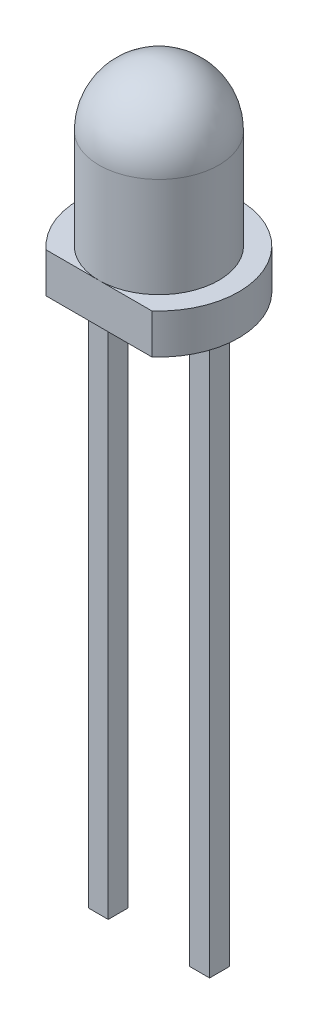
ISO-10303-21;
HEADER;
FILE_DESCRIPTION(('STEP AP214'),'2;1');
FILE_NAME('part.step','',(''),(''),'','','');
FILE_SCHEMA(('AUTOMOTIVE_DESIGN { 1 0 10303 214 1 1 1 1 }'));
ENDSEC;
DATA;
#1=APPLICATION_CONTEXT('core data for automotive mechanical design processes');
#2=APPLICATION_PROTOCOL_DEFINITION('international standard','automotive_design',2000,#1);
#3=PRODUCT_CONTEXT('',#1,'mechanical');
#4=PRODUCT('Part','Part','',(#3));
#5=PRODUCT_RELATED_PRODUCT_CATEGORY('part','',(#4));
#6=PRODUCT_DEFINITION_FORMATION('','',#4);
#7=PRODUCT_DEFINITION_CONTEXT('part definition',#1,'design');
#8=PRODUCT_DEFINITION('design','',#6,#7);
#9=PRODUCT_DEFINITION_SHAPE('','',#8);
#10=(LENGTH_UNIT() NAMED_UNIT(*) SI_UNIT(.MILLI.,.METRE.));
#11=(NAMED_UNIT(*) PLANE_ANGLE_UNIT() SI_UNIT($,.RADIAN.));
#12=(NAMED_UNIT(*) SI_UNIT($,.STERADIAN.) SOLID_ANGLE_UNIT());
#13=UNCERTAINTY_MEASURE_WITH_UNIT(LENGTH_MEASURE(1.E-05),#10,'distance_accuracy_value','');
#14=(GEOMETRIC_REPRESENTATION_CONTEXT(3) GLOBAL_UNCERTAINTY_ASSIGNED_CONTEXT((#13)) GLOBAL_UNIT_ASSIGNED_CONTEXT((#10,
#11,#12)) REPRESENTATION_CONTEXT('',''));
#15=CARTESIAN_POINT('',(0.,0.,0.));
#16=DIRECTION('',(0.,0.,1.));
#17=DIRECTION('',(1.,0.,0.));
#18=AXIS2_PLACEMENT_3D('',#15,#16,#17);
#19=CARTESIAN_POINT('',(1.02,-14.,0.25));
#20=DIRECTION('',(1.,0.,0.));
#21=DIRECTION('',(0.,0.,-1.));
#22=AXIS2_PLACEMENT_3D('',#19,#20,#21);
#23=PLANE('',#22);
#24=DIRECTION('',(0.,0.,-1.));
#25=VECTOR('',#24,1.);
#26=CARTESIAN_POINT('',(1.02,0.,0.25));
#27=LINE('',#26,#25);
#28=CARTESIAN_POINT('',(1.02,0.,0.25));
#29=VERTEX_POINT('',#28);
#30=CARTESIAN_POINT('',(1.02,0.,-0.25));
#31=VERTEX_POINT('',#30);
#32=EDGE_CURVE('E12',#29,#31,#27,.T.);
#33=ORIENTED_EDGE('',*,*,#32,.T.);
#34=DIRECTION('',(0.,1.,0.));
#35=VECTOR('',#34,1.);
#36=CARTESIAN_POINT('',(1.02,-14.,-0.25));
#37=LINE('',#36,#35);
#38=CARTESIAN_POINT('',(1.02,-14.,-0.25));
#39=VERTEX_POINT('',#38);
#40=EDGE_CURVE('E121',#39,#31,#37,.T.);
#41=ORIENTED_EDGE('',*,*,#40,.F.);
#42=DIRECTION('',(0.,0.,-1.));
#43=VECTOR('',#42,1.);
#44=CARTESIAN_POINT('',(1.02,-14.,0.25));
#45=LINE('',#44,#43);
#46=CARTESIAN_POINT('',(1.02,-14.,0.25));
#47=VERTEX_POINT('',#46);
#48=EDGE_CURVE('E54',#47,#39,#45,.T.);
#49=ORIENTED_EDGE('',*,*,#48,.F.);
#50=DIRECTION('',(0.,1.,0.));
#51=VECTOR('',#50,1.);
#52=CARTESIAN_POINT('',(1.02,-14.,0.25));
#53=LINE('',#52,#51);
#54=EDGE_CURVE('E109',#47,#29,#53,.T.);
#55=ORIENTED_EDGE('',*,*,#54,.T.);
#56=EDGE_LOOP('',(#33,#41,#49,#55));
#57=FACE_BOUND('',#56,.T.);
#58=ADVANCED_FACE('F50',(#57),#23,.F.);
#59=CARTESIAN_POINT('',(1.02,-14.,-0.25));
#60=DIRECTION('',(0.,0.,1.));
#61=DIRECTION('',(1.,0.,0.));
#62=AXIS2_PLACEMENT_3D('',#59,#60,#61);
#63=PLANE('',#62);
#64=DIRECTION('',(1.,0.,0.));
#65=VECTOR('',#64,1.);
#66=CARTESIAN_POINT('',(1.02,0.,-0.25));
#67=LINE('',#66,#65);
#68=CARTESIAN_POINT('',(1.52,0.,-0.25));
#69=VERTEX_POINT('',#68);
#70=EDGE_CURVE('E60',#31,#69,#67,.T.);
#71=ORIENTED_EDGE('',*,*,#70,.T.);
#72=DIRECTION('',(0.,1.,0.));
#73=VECTOR('',#72,1.);
#74=CARTESIAN_POINT('',(1.52,-14.,-0.25));
#75=LINE('',#74,#73);
#76=CARTESIAN_POINT('',(1.52,-14.,-0.25));
#77=VERTEX_POINT('',#76);
#78=EDGE_CURVE('E105',#77,#69,#75,.T.);
#79=ORIENTED_EDGE('',*,*,#78,.F.);
#80=DIRECTION('',(1.,0.,0.));
#81=VECTOR('',#80,1.);
#82=CARTESIAN_POINT('',(1.02,-14.,-0.25));
#83=LINE('',#82,#81);
#84=EDGE_CURVE('E84',#39,#77,#83,.T.);
#85=ORIENTED_EDGE('',*,*,#84,.F.);
#86=ORIENTED_EDGE('',*,*,#40,.T.);
#87=EDGE_LOOP('',(#71,#79,#85,#86));
#88=FACE_BOUND('',#87,.T.);
#89=ADVANCED_FACE('F124',(#88),#63,.F.);
#90=CARTESIAN_POINT('',(1.52,-14.,0.25));
#91=DIRECTION('',(-1.,0.,0.));
#92=DIRECTION('',(0.,0.,1.));
#93=AXIS2_PLACEMENT_3D('',#90,#91,#92);
#94=PLANE('',#93);
#95=DIRECTION('',(0.,0.,1.));
#96=VECTOR('',#95,1.);
#97=CARTESIAN_POINT('',(1.52,0.,0.25));
#98=LINE('',#97,#96);
#99=CARTESIAN_POINT('',(1.52,0.,0.25));
#100=VERTEX_POINT('',#99);
#101=EDGE_CURVE('E100',#69,#100,#98,.T.);
#102=ORIENTED_EDGE('',*,*,#101,.T.);
#103=DIRECTION('',(0.,1.,0.));
#104=VECTOR('',#103,1.);
#105=CARTESIAN_POINT('',(1.52,-14.,0.25));
#106=LINE('',#105,#104);
#107=CARTESIAN_POINT('',(1.52,-14.,0.25));
#108=VERTEX_POINT('',#107);
#109=EDGE_CURVE('E103',#108,#100,#106,.T.);
#110=ORIENTED_EDGE('',*,*,#109,.F.);
#111=DIRECTION('',(0.,0.,1.));
#112=VECTOR('',#111,1.);
#113=CARTESIAN_POINT('',(1.52,-14.,0.25));
#114=LINE('',#113,#112);
#115=EDGE_CURVE('E117',#77,#108,#114,.T.);
#116=ORIENTED_EDGE('',*,*,#115,.F.);
#117=ORIENTED_EDGE('',*,*,#78,.T.);
#118=EDGE_LOOP('',(#102,#110,#116,#117));
#119=FACE_BOUND('',#118,.T.);
#120=ADVANCED_FACE('F101',(#119),#94,.F.);
#121=CARTESIAN_POINT('',(1.02,-14.,0.25));
#122=DIRECTION('',(0.,0.,-1.));
#123=DIRECTION('',(-1.,0.,0.));
#124=AXIS2_PLACEMENT_3D('',#121,#122,#123);
#125=PLANE('',#124);
#126=DIRECTION('',(-1.,0.,0.));
#127=VECTOR('',#126,1.);
#128=CARTESIAN_POINT('',(1.02,0.,0.25));
#129=LINE('',#128,#127);
#130=EDGE_CURVE('E94',#100,#29,#129,.T.);
#131=ORIENTED_EDGE('',*,*,#130,.T.);
#132=ORIENTED_EDGE('',*,*,#54,.F.);
#133=DIRECTION('',(-1.,0.,0.));
#134=VECTOR('',#133,1.);
#135=CARTESIAN_POINT('',(1.02,-14.,0.25));
#136=LINE('',#135,#134);
#137=EDGE_CURVE('E108',#108,#47,#136,.T.);
#138=ORIENTED_EDGE('',*,*,#137,.F.);
#139=ORIENTED_EDGE('',*,*,#109,.T.);
#140=EDGE_LOOP('',(#131,#132,#138,#139));
#141=FACE_BOUND('',#140,.T.);
#142=ADVANCED_FACE('F107',(#141),#125,.F.);
#143=CARTESIAN_POINT('',(0.,-14.,0.));
#144=DIRECTION('',(0.,-1.,0.));
#145=DIRECTION('',(0.,0.,-1.));
#146=AXIS2_PLACEMENT_3D('',#143,#144,#145);
#147=PLANE('',#146);
#148=ORIENTED_EDGE('',*,*,#48,.T.);
#149=ORIENTED_EDGE('',*,*,#84,.T.);
#150=ORIENTED_EDGE('',*,*,#115,.T.);
#151=ORIENTED_EDGE('',*,*,#137,.T.);
#152=EDGE_LOOP('',(#148,#149,#150,#151));
#153=FACE_BOUND('',#152,.T.);
#154=ADVANCED_FACE('F52',(#153),#147,.T.);
#155=CARTESIAN_POINT('',(0.,0.,0.));
#156=DIRECTION('',(0.,-1.,0.));
#157=DIRECTION('',(0.,0.,-1.));
#158=AXIS2_PLACEMENT_3D('',#155,#156,#157);
#159=PLANE('',#158);
#160=ORIENTED_EDGE('',*,*,#32,.F.);
#161=ORIENTED_EDGE('',*,*,#130,.F.);
#162=ORIENTED_EDGE('',*,*,#101,.F.);
#163=ORIENTED_EDGE('',*,*,#70,.F.);
#164=EDGE_LOOP('',(#160,#161,#162,#163));
#165=FACE_BOUND('',#164,.T.);
#166=ADVANCED_FACE('F111',(#165),#159,.F.);
#167=CLOSED_SHELL('',(#58,#89,#120,#142,#154,#166));
#168=MANIFOLD_SOLID_BREP('B2',#167);
#169=CARTESIAN_POINT('',(-1.52,-14.,0.25));
#170=DIRECTION('',(1.,0.,0.));
#171=DIRECTION('',(0.,0.,-1.));
#172=AXIS2_PLACEMENT_3D('',#169,#170,#171);
#173=PLANE('',#172);
#174=DIRECTION('',(0.,0.,-1.));
#175=VECTOR('',#174,1.);
#176=CARTESIAN_POINT('',(-1.52,0.,0.25));
#177=LINE('',#176,#175);
#178=CARTESIAN_POINT('',(-1.52,0.,0.25));
#179=VERTEX_POINT('',#178);
#180=CARTESIAN_POINT('',(-1.52,0.,-0.25));
#181=VERTEX_POINT('',#180);
#182=EDGE_CURVE('E258',#179,#181,#177,.T.);
#183=ORIENTED_EDGE('',*,*,#182,.T.);
#184=DIRECTION('',(0.,1.,0.));
#185=VECTOR('',#184,1.);
#186=CARTESIAN_POINT('',(-1.52,-14.,-0.25));
#187=LINE('',#186,#185);
#188=CARTESIAN_POINT('',(-1.52,-14.,-0.25));
#189=VERTEX_POINT('',#188);
#190=EDGE_CURVE('E48',#189,#181,#187,.T.);
#191=ORIENTED_EDGE('',*,*,#190,.F.);
#192=DIRECTION('',(0.,0.,-1.));
#193=VECTOR('',#192,1.);
#194=CARTESIAN_POINT('',(-1.52,-14.,0.25));
#195=LINE('',#194,#193);
#196=CARTESIAN_POINT('',(-1.52,-14.,0.25));
#197=VERTEX_POINT('',#196);
#198=EDGE_CURVE('E246',#197,#189,#195,.T.);
#199=ORIENTED_EDGE('',*,*,#198,.F.);
#200=DIRECTION('',(0.,1.,0.));
#201=VECTOR('',#200,1.);
#202=CARTESIAN_POINT('',(-1.52,-14.,0.25));
#203=LINE('',#202,#201);
#204=EDGE_CURVE('E254',#197,#179,#203,.T.);
#205=ORIENTED_EDGE('',*,*,#204,.T.);
#206=EDGE_LOOP('',(#183,#191,#199,#205));
#207=FACE_BOUND('',#206,.T.);
#208=ADVANCED_FACE('F195',(#207),#173,.F.);
#209=CARTESIAN_POINT('',(-1.52,-14.,-0.25));
#210=DIRECTION('',(0.,0.,1.));
#211=DIRECTION('',(1.,0.,0.));
#212=AXIS2_PLACEMENT_3D('',#209,#210,#211);
#213=PLANE('',#212);
#214=DIRECTION('',(1.,0.,0.));
#215=VECTOR('',#214,1.);
#216=CARTESIAN_POINT('',(-1.52,0.,-0.25));
#217=LINE('',#216,#215);
#218=CARTESIAN_POINT('',(-1.02,0.,-0.25));
#219=VERTEX_POINT('',#218);
#220=EDGE_CURVE('E250',#181,#219,#217,.T.);
#221=ORIENTED_EDGE('',*,*,#220,.T.);
#222=DIRECTION('',(0.,1.,0.));
#223=VECTOR('',#222,1.);
#224=CARTESIAN_POINT('',(-1.02,-14.,-0.25));
#225=LINE('',#224,#223);
#226=CARTESIAN_POINT('',(-1.02,-14.,-0.25));
#227=VERTEX_POINT('',#226);
#228=EDGE_CURVE('E203',#227,#219,#225,.T.);
#229=ORIENTED_EDGE('',*,*,#228,.F.);
#230=DIRECTION('',(1.,0.,0.));
#231=VECTOR('',#230,1.);
#232=CARTESIAN_POINT('',(-1.52,-14.,-0.25));
#233=LINE('',#232,#231);
#234=EDGE_CURVE('E241',#189,#227,#233,.T.);
#235=ORIENTED_EDGE('',*,*,#234,.F.);
#236=ORIENTED_EDGE('',*,*,#190,.T.);
#237=EDGE_LOOP('',(#221,#229,#235,#236));
#238=FACE_BOUND('',#237,.T.);
#239=ADVANCED_FACE('F249',(#238),#213,.F.);
#240=CARTESIAN_POINT('',(-1.02,-14.,0.25));
#241=DIRECTION('',(-1.,0.,0.));
#242=DIRECTION('',(0.,0.,1.));
#243=AXIS2_PLACEMENT_3D('',#240,#241,#242);
#244=PLANE('',#243);
#245=DIRECTION('',(0.,0.,1.));
#246=VECTOR('',#245,1.);
#247=CARTESIAN_POINT('',(-1.02,0.,0.25));
#248=LINE('',#247,#246);
#249=CARTESIAN_POINT('',(-1.02,0.,0.25));
#250=VERTEX_POINT('',#249);
#251=EDGE_CURVE('E228',#219,#250,#248,.T.);
#252=ORIENTED_EDGE('',*,*,#251,.T.);
#253=DIRECTION('',(0.,1.,0.));
#254=VECTOR('',#253,1.);
#255=CARTESIAN_POINT('',(-1.02,-14.,0.25));
#256=LINE('',#255,#254);
#257=CARTESIAN_POINT('',(-1.02,-14.,0.25));
#258=VERTEX_POINT('',#257);
#259=EDGE_CURVE('E251',#258,#250,#256,.T.);
#260=ORIENTED_EDGE('',*,*,#259,.F.);
#261=DIRECTION('',(0.,0.,1.));
#262=VECTOR('',#261,1.);
#263=CARTESIAN_POINT('',(-1.02,-14.,0.25));
#264=LINE('',#263,#262);
#265=EDGE_CURVE('E244',#227,#258,#264,.T.);
#266=ORIENTED_EDGE('',*,*,#265,.F.);
#267=ORIENTED_EDGE('',*,*,#228,.T.);
#268=EDGE_LOOP('',(#252,#260,#266,#267));
#269=FACE_BOUND('',#268,.T.);
#270=ADVANCED_FACE('F252',(#269),#244,.F.);
#271=CARTESIAN_POINT('',(-1.52,-14.,0.25));
#272=DIRECTION('',(0.,0.,-1.));
#273=DIRECTION('',(-1.,0.,0.));
#274=AXIS2_PLACEMENT_3D('',#271,#272,#273);
#275=PLANE('',#274);
#276=DIRECTION('',(-1.,0.,0.));
#277=VECTOR('',#276,1.);
#278=CARTESIAN_POINT('',(-1.52,0.,0.25));
#279=LINE('',#278,#277);
#280=EDGE_CURVE('E234',#250,#179,#279,.T.);
#281=ORIENTED_EDGE('',*,*,#280,.T.);
#282=ORIENTED_EDGE('',*,*,#204,.F.);
#283=DIRECTION('',(-1.,0.,0.));
#284=VECTOR('',#283,1.);
#285=CARTESIAN_POINT('',(-1.52,-14.,0.25));
#286=LINE('',#285,#284);
#287=EDGE_CURVE('E211',#258,#197,#286,.T.);
#288=ORIENTED_EDGE('',*,*,#287,.F.);
#289=ORIENTED_EDGE('',*,*,#259,.T.);
#290=EDGE_LOOP('',(#281,#282,#288,#289));
#291=FACE_BOUND('',#290,.T.);
#292=ADVANCED_FACE('F265',(#291),#275,.F.);
#293=CARTESIAN_POINT('',(0.,-14.,0.));
#294=DIRECTION('',(0.,-1.,0.));
#295=DIRECTION('',(0.,0.,-1.));
#296=AXIS2_PLACEMENT_3D('',#293,#294,#295);
#297=PLANE('',#296);
#298=ORIENTED_EDGE('',*,*,#198,.T.);
#299=ORIENTED_EDGE('',*,*,#234,.T.);
#300=ORIENTED_EDGE('',*,*,#265,.T.);
#301=ORIENTED_EDGE('',*,*,#287,.T.);
#302=EDGE_LOOP('',(#298,#299,#300,#301));
#303=FACE_BOUND('',#302,.T.);
#304=ADVANCED_FACE('F242',(#303),#297,.T.);
#305=CARTESIAN_POINT('',(0.,0.,0.));
#306=DIRECTION('',(0.,-1.,0.));
#307=DIRECTION('',(0.,0.,-1.));
#308=AXIS2_PLACEMENT_3D('',#305,#306,#307);
#309=PLANE('',#308);
#310=ORIENTED_EDGE('',*,*,#182,.F.);
#311=ORIENTED_EDGE('',*,*,#280,.F.);
#312=ORIENTED_EDGE('',*,*,#251,.F.);
#313=ORIENTED_EDGE('',*,*,#220,.F.);
#314=EDGE_LOOP('',(#310,#311,#312,#313));
#315=FACE_BOUND('',#314,.T.);
#316=ADVANCED_FACE('F268',(#315),#309,.F.);
#317=CLOSED_SHELL('',(#208,#239,#270,#292,#304,#316));
#318=MANIFOLD_SOLID_BREP('B6',#317);
#319=CARTESIAN_POINT('',(0.,5.,0.));
#320=DIRECTION('',(0.,1.,0.));
#321=DIRECTION('',(0.,0.,1.));
#322=AXIS2_PLACEMENT_3D('',#319,#320,#321);
#323=CYLINDRICAL_SURFACE('',#322,1.5);
#324=CARTESIAN_POINT('',(0.,1.,0.));
#325=DIRECTION('',(0.,1.,0.));
#326=DIRECTION('',(0.,0.,1.));
#327=AXIS2_PLACEMENT_3D('',#324,#325,#326);
#328=CIRCLE('',#327,1.5);
#329=CARTESIAN_POINT('',(0.,1.,1.5));
#330=VERTEX_POINT('',#329);
#331=EDGE_CURVE('E193',#330,#330,#328,.F.);
#332=ORIENTED_EDGE('',*,*,#331,.F.);
#333=EDGE_LOOP('',(#332));
#334=FACE_BOUND('',#333,.T.);
#335=CARTESIAN_POINT('',(0.,3.5,0.));
#336=DIRECTION('',(0.,1.,0.));
#337=DIRECTION('',(0.,0.,1.));
#338=AXIS2_PLACEMENT_3D('',#335,#336,#337);
#339=CIRCLE('',#338,1.5);
#340=CARTESIAN_POINT('',(0.,3.5,1.5));
#341=VERTEX_POINT('',#340);
#342=EDGE_CURVE('E339',#341,#341,#339,.T.);
#343=ORIENTED_EDGE('',*,*,#342,.F.);
#344=EDGE_LOOP('',(#343));
#345=FACE_BOUND('',#344,.T.);
#346=ADVANCED_FACE('F331',(#334,#345),#323,.T.);
#347=CARTESIAN_POINT('',(0.,3.5,0.));
#348=DIRECTION('',(0.,1.,0.));
#349=DIRECTION('',(0.,0.,1.));
#350=AXIS2_PLACEMENT_3D('',#347,#348,#349);
#351=SPHERICAL_SURFACE('',#350,1.5);
#352=ORIENTED_EDGE('',*,*,#342,.T.);
#353=EDGE_LOOP('',(#352));
#354=FACE_BOUND('',#353,.T.);
#355=ADVANCED_FACE('F384',(#354),#351,.T.);
#356=CARTESIAN_POINT('',(-1.3228756555323,1.,1.5));
#357=DIRECTION('',(0.,0.,-1.));
#358=DIRECTION('',(-1.,0.,0.));
#359=AXIS2_PLACEMENT_3D('',#356,#357,#358);
#360=PLANE('',#359);
#361=DIRECTION('',(1.,0.,0.));
#362=VECTOR('',#361,1.);
#363=CARTESIAN_POINT('',(-1.3228756555323,1.,1.5));
#364=LINE('',#363,#362);
#365=CARTESIAN_POINT('',(1.3228756555323,1.,1.5));
#366=VERTEX_POINT('',#365);
#367=EDGE_CURVE('E349',#330,#366,#364,.T.);
#368=ORIENTED_EDGE('',*,*,#367,.F.);
#369=CARTESIAN_POINT('',(-1.3228756555323,1.,1.5));
#370=VERTEX_POINT('',#369);
#371=EDGE_CURVE('E375',#370,#330,#364,.T.);
#372=ORIENTED_EDGE('',*,*,#371,.F.);
#373=DIRECTION('',(0.,-1.,0.));
#374=VECTOR('',#373,1.);
#375=CARTESIAN_POINT('',(-1.3228756555323,1.,1.5));
#376=LINE('',#375,#374);
#377=CARTESIAN_POINT('',(-1.3228756555323,0.,1.5));
#378=VERTEX_POINT('',#377);
#379=EDGE_CURVE('E366',#370,#378,#376,.T.);
#380=ORIENTED_EDGE('',*,*,#379,.T.);
#381=DIRECTION('',(1.,0.,0.));
#382=VECTOR('',#381,1.);
#383=CARTESIAN_POINT('',(-1.3228756555323,0.,1.5));
#384=LINE('',#383,#382);
#385=CARTESIAN_POINT('',(1.3228756555323,0.,1.5));
#386=VERTEX_POINT('',#385);
#387=EDGE_CURVE('E360',#378,#386,#384,.T.);
#388=ORIENTED_EDGE('',*,*,#387,.T.);
#389=DIRECTION('',(0.,-1.,0.));
#390=VECTOR('',#389,1.);
#391=CARTESIAN_POINT('',(1.3228756555323,1.,1.5));
#392=LINE('',#391,#390);
#393=EDGE_CURVE('E363',#366,#386,#392,.T.);
#394=ORIENTED_EDGE('',*,*,#393,.F.);
#395=EDGE_LOOP('',(#368,#372,#380,#388,#394));
#396=FACE_BOUND('',#395,.T.);
#397=ADVANCED_FACE('F362',(#396),#360,.F.);
#398=CARTESIAN_POINT('',(0.,1.,0.));
#399=DIRECTION('',(0.,-1.,0.));
#400=DIRECTION('',(0.,0.,-1.));
#401=AXIS2_PLACEMENT_3D('',#398,#399,#400);
#402=CYLINDRICAL_SURFACE('',#401,2.);
#403=CARTESIAN_POINT('',(0.,0.,0.));
#404=DIRECTION('',(0.,1.,0.));
#405=DIRECTION('',(0.,0.,1.));
#406=AXIS2_PLACEMENT_3D('',#403,#404,#405);
#407=CIRCLE('',#406,2.);
#408=EDGE_CURVE('E371',#386,#378,#407,.T.);
#409=ORIENTED_EDGE('',*,*,#408,.T.);
#410=ORIENTED_EDGE('',*,*,#379,.F.);
#411=CARTESIAN_POINT('',(0.,1.,0.));
#412=DIRECTION('',(0.,1.,0.));
#413=DIRECTION('',(0.,0.,1.));
#414=AXIS2_PLACEMENT_3D('',#411,#412,#413);
#415=CIRCLE('',#414,2.);
#416=EDGE_CURVE('E370',#366,#370,#415,.T.);
#417=ORIENTED_EDGE('',*,*,#416,.F.);
#418=ORIENTED_EDGE('',*,*,#393,.T.);
#419=EDGE_LOOP('',(#409,#410,#417,#418));
#420=FACE_BOUND('',#419,.T.);
#421=ADVANCED_FACE('F374',(#420),#402,.T.);
#422=CARTESIAN_POINT('',(0.,1.,0.));
#423=DIRECTION('',(0.,1.,0.));
#424=DIRECTION('',(0.,0.,1.));
#425=AXIS2_PLACEMENT_3D('',#422,#423,#424);
#426=PLANE('',#425);
#427=ORIENTED_EDGE('',*,*,#371,.T.);
#428=ORIENTED_EDGE('',*,*,#331,.T.);
#429=ORIENTED_EDGE('',*,*,#367,.T.);
#430=ORIENTED_EDGE('',*,*,#416,.T.);
#431=EDGE_LOOP('',(#427,#428,#429,#430));
#432=FACE_BOUND('',#431,.T.);
#433=ADVANCED_FACE('F394',(#432),#426,.T.);
#434=CARTESIAN_POINT('',(0.,0.,0.));
#435=DIRECTION('',(0.,-1.,0.));
#436=DIRECTION('',(0.,0.,-1.));
#437=AXIS2_PLACEMENT_3D('',#434,#435,#436);
#438=PLANE('',#437);
#439=ORIENTED_EDGE('',*,*,#387,.F.);
#440=ORIENTED_EDGE('',*,*,#408,.F.);
#441=EDGE_LOOP('',(#439,#440));
#442=FACE_BOUND('',#441,.T.);
#443=ADVANCED_FACE('F333',(#442),#438,.T.);
#444=CLOSED_SHELL('',(#346,#355,#397,#421,#433,#443));
#445=MANIFOLD_SOLID_BREP('B42',#444);
#446=ADVANCED_BREP_SHAPE_REPRESENTATION('',(#18,#168,#318,#445),#14);
#447=SHAPE_DEFINITION_REPRESENTATION(#9,#446);
ENDSEC;
END-ISO-10303-21;
